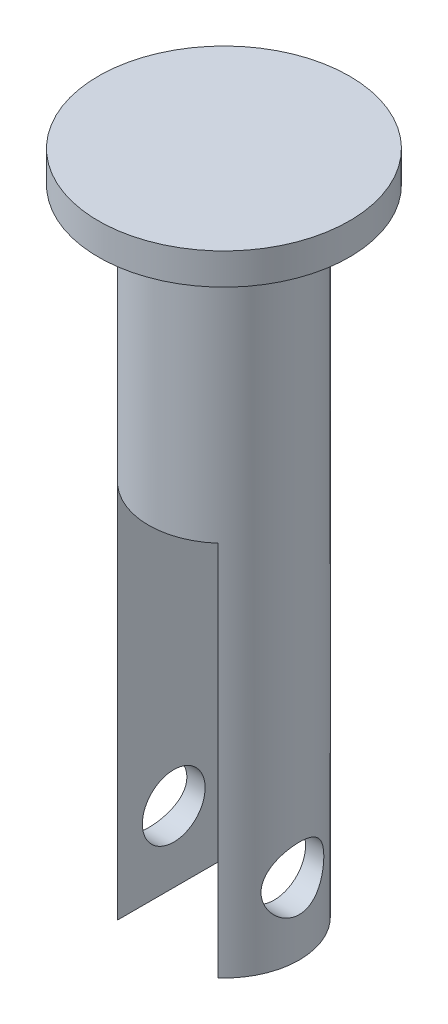
ISO-10303-21;
HEADER;
FILE_DESCRIPTION(('STEP AP214'),'2;1');
FILE_NAME('part.step','',(''),(''),'','','');
FILE_SCHEMA(('AUTOMOTIVE_DESIGN { 1 0 10303 214 1 1 1 1 }'));
ENDSEC;
DATA;
#1=APPLICATION_CONTEXT('core data for automotive mechanical design processes');
#2=APPLICATION_PROTOCOL_DEFINITION('international standard','automotive_design',2000,#1);
#3=PRODUCT_CONTEXT('',#1,'mechanical');
#4=PRODUCT('Part','Part','',(#3));
#5=PRODUCT_RELATED_PRODUCT_CATEGORY('part','',(#4));
#6=PRODUCT_DEFINITION_FORMATION('','',#4);
#7=PRODUCT_DEFINITION_CONTEXT('part definition',#1,'design');
#8=PRODUCT_DEFINITION('design','',#6,#7);
#9=PRODUCT_DEFINITION_SHAPE('','',#8);
#10=(LENGTH_UNIT() NAMED_UNIT(*) SI_UNIT(.MILLI.,.METRE.));
#11=(NAMED_UNIT(*) PLANE_ANGLE_UNIT() SI_UNIT($,.RADIAN.));
#12=(NAMED_UNIT(*) SI_UNIT($,.STERADIAN.) SOLID_ANGLE_UNIT());
#13=UNCERTAINTY_MEASURE_WITH_UNIT(LENGTH_MEASURE(1.E-05),#10,'distance_accuracy_value','');
#14=(GEOMETRIC_REPRESENTATION_CONTEXT(3) GLOBAL_UNCERTAINTY_ASSIGNED_CONTEXT((#13)) GLOBAL_UNIT_ASSIGNED_CONTEXT((#10,
#11,#12)) REPRESENTATION_CONTEXT('',''));
#15=CARTESIAN_POINT('',(0.,0.,0.));
#16=DIRECTION('',(0.,0.,1.));
#17=DIRECTION('',(1.,0.,0.));
#18=AXIS2_PLACEMENT_3D('',#15,#16,#17);
#19=CARTESIAN_POINT('',(11.5440696875448,6.06648320026665,0.));
#20=DIRECTION('',(0.,-1.,0.));
#21=DIRECTION('',(0.,0.,-1.));
#22=AXIS2_PLACEMENT_3D('',#19,#20,#21);
#23=PLANE('',#22);
#24=CARTESIAN_POINT('',(-0.455930312455166,6.06648320026665,0.));
#25=DIRECTION('',(0.,-1.,0.));
#26=DIRECTION('',(0.,0.,-1.));
#27=AXIS2_PLACEMENT_3D('',#24,#25,#26);
#28=CIRCLE('',#27,12.);
#29=CARTESIAN_POINT('',(7.54406968754483,6.06648320026665,-8.94427190999918));
#30=VERTEX_POINT('',#29);
#31=CARTESIAN_POINT('',(7.54406968754483,6.06648320026665,8.94427190999918));
#32=VERTEX_POINT('',#31);
#33=EDGE_CURVE('E93',#30,#32,#28,.T.);
#34=ORIENTED_EDGE('',*,*,#33,.T.);
#35=DIRECTION('',(0.,0.,-1.));
#36=VECTOR('',#35,1.);
#37=CARTESIAN_POINT('',(7.54406968754483,6.06648320026665,0.));
#38=LINE('',#37,#36);
#39=EDGE_CURVE('E112',#32,#30,#38,.T.);
#40=ORIENTED_EDGE('',*,*,#39,.T.);
#41=EDGE_LOOP('',(#34,#40));
#42=FACE_BOUND('',#41,.T.);
#43=ADVANCED_FACE('F35',(#42),#23,.T.);
#44=CARTESIAN_POINT('',(-0.455930312455166,6.06648320026665,0.));
#45=DIRECTION('',(0.,-1.,0.));
#46=DIRECTION('',(0.,0.,-1.));
#47=AXIS2_PLACEMENT_3D('',#44,#45,#46);
#48=CYLINDRICAL_SURFACE('',#47,20.);
#49=CARTESIAN_POINT('',(-0.455930312455166,112.066483200267,0.));
#50=DIRECTION('',(0.,-1.,0.));
#51=DIRECTION('',(0.,0.,-1.));
#52=AXIS2_PLACEMENT_3D('',#49,#50,#51);
#53=CIRCLE('',#52,20.);
#54=CARTESIAN_POINT('',(-0.455930312455166,112.066483200267,-20.));
#55=VERTEX_POINT('',#54);
#56=EDGE_CURVE('E101',#55,#55,#53,.T.);
#57=ORIENTED_EDGE('',*,*,#56,.T.);
#58=EDGE_LOOP('',(#57));
#59=FACE_BOUND('',#58,.T.);
#60=CARTESIAN_POINT('',(-0.455930312455166,107.066483200267,0.));
#61=DIRECTION('',(0.,-1.,0.));
#62=DIRECTION('',(0.,0.,-1.));
#63=AXIS2_PLACEMENT_3D('',#60,#61,#62);
#64=CIRCLE('',#63,20.);
#65=CARTESIAN_POINT('',(-0.455930312455166,107.066483200267,-20.));
#66=VERTEX_POINT('',#65);
#67=EDGE_CURVE('E109',#66,#66,#64,.T.);
#68=ORIENTED_EDGE('',*,*,#67,.F.);
#69=EDGE_LOOP('',(#68));
#70=FACE_BOUND('',#69,.T.);
#71=ADVANCED_FACE('F37',(#59,#70),#48,.T.);
#72=CARTESIAN_POINT('',(19.5440696875448,107.066483200267,0.));
#73=DIRECTION('',(0.,-1.,0.));
#74=DIRECTION('',(0.,0.,-1.));
#75=AXIS2_PLACEMENT_3D('',#72,#73,#74);
#76=PLANE('',#75);
#77=ORIENTED_EDGE('',*,*,#67,.T.);
#78=EDGE_LOOP('',(#77));
#79=FACE_BOUND('',#78,.T.);
#80=CARTESIAN_POINT('',(-0.455930312455166,107.066483200267,0.));
#81=DIRECTION('',(0.,-1.,0.));
#82=DIRECTION('',(0.,0.,-1.));
#83=AXIS2_PLACEMENT_3D('',#80,#81,#82);
#84=CIRCLE('',#83,12.);
#85=CARTESIAN_POINT('',(-0.455930312455166,107.066483200267,-12.));
#86=VERTEX_POINT('',#85);
#87=EDGE_CURVE('E106',#86,#86,#84,.T.);
#88=ORIENTED_EDGE('',*,*,#87,.F.);
#89=EDGE_LOOP('',(#88));
#90=FACE_BOUND('',#89,.T.);
#91=ADVANCED_FACE('F155',(#79,#90),#76,.T.);
#92=CARTESIAN_POINT('',(-0.455930312455166,6.06648320026665,0.));
#93=DIRECTION('',(0.,-1.,0.));
#94=DIRECTION('',(0.,0.,-1.));
#95=AXIS2_PLACEMENT_3D('',#92,#93,#94);
#96=CYLINDRICAL_SURFACE('',#95,12.);
#97=CARTESIAN_POINT('',(-11.3646424270909,17.3470750969617,-5.));
#98=CARTESIAN_POINT('',(-11.3646433889083,17.213673754876,-4.99999907346954));
#99=CARTESIAN_POINT('',(-11.3670979079183,17.0802250063997,-4.99465346647854));
#100=CARTESIAN_POINT('',(-11.3768355291006,16.8142982175734,-4.97332510133915));
#101=CARTESIAN_POINT('',(-11.3841217834814,16.6818208680448,-4.95733539899108));
#102=CARTESIAN_POINT('',(-11.4032949525651,16.4186056235057,-4.91485001389297));
#103=CARTESIAN_POINT('',(-11.4151916415178,16.2878720385531,-4.88833200790255));
#104=CARTESIAN_POINT('',(-11.4431936601102,16.0293167779945,-4.82506361967691));
#105=CARTESIAN_POINT('',(-11.4593007604643,15.9014963521828,-4.7883089319155));
#106=CARTESIAN_POINT('',(-11.495129607935,15.6502214656092,-4.7051161177753));
#107=CARTESIAN_POINT('',(-11.5148346442353,15.5267498449541,-4.65872262741865));
#108=CARTESIAN_POINT('',(-11.5573196855297,15.2842808424347,-4.5565572335341));
#109=CARTESIAN_POINT('',(-11.5801008476228,15.1652851658574,-4.5007817989946));
#110=CARTESIAN_POINT('',(-11.6520781180096,14.8161762680823,-4.32007909456559));
#111=CARTESIAN_POINT('',(-11.7049557990801,14.5936243226733,-4.18166963633182));
#112=CARTESIAN_POINT('',(-11.81816439707,14.1617374200267,-3.86388960131915));
#113=CARTESIAN_POINT('',(-11.8787475171841,13.9538569246124,-3.68264836841193));
#114=CARTESIAN_POINT('',(-11.9985076479036,13.570262139705,-3.28805127368673));
#115=CARTESIAN_POINT('',(-12.0576841087455,13.394560252364,-3.07468308711391));
#116=CARTESIAN_POINT('',(-12.1420475754237,13.1552717190608,-2.72939811902874));
#117=CARTESIAN_POINT('',(-12.1699673241129,13.0782225932807,-2.60726265021164));
#118=CARTESIAN_POINT('',(-12.2230060916566,12.9347607497602,-2.35633907958865));
#119=CARTESIAN_POINT('',(-12.2481262718197,12.8683436166621,-2.22755376893512));
#120=CARTESIAN_POINT('',(-12.2948477532332,12.7467361117422,-1.96416180919324));
#121=CARTESIAN_POINT('',(-12.3164487183859,12.691546812094,-1.82955460564478));
#122=CARTESIAN_POINT('',(-12.3554832392034,12.592981193246,-1.55556138641083));
#123=CARTESIAN_POINT('',(-12.3729188729236,12.5495989820598,-1.41617779348791));
#124=CARTESIAN_POINT('',(-12.4023246899177,12.477025755724,-1.14097065626753));
#125=CARTESIAN_POINT('',(-12.4145305774195,12.447217690051,-1.00533485679253));
#126=CARTESIAN_POINT('',(-12.4343812276892,12.3989672723049,-0.73178367802263));
#127=CARTESIAN_POINT('',(-12.4420280212041,12.380519859761,-0.593869341827157));
#128=CARTESIAN_POINT('',(-12.4525481354847,12.3551844577486,-0.316820356986365));
#129=CARTESIAN_POINT('',(-12.4554221152877,12.3482948723566,-0.17768587948762));
#130=CARTESIAN_POINT('',(-12.4563149877906,12.3461517775978,0.100685666016498));
#131=CARTESIAN_POINT('',(-12.4543340685963,12.3508978174019,0.23992272983814));
#132=CARTESIAN_POINT('',(-12.4458439730803,12.3713231155269,0.508875497772578));
#133=CARTESIAN_POINT('',(-12.4396189964014,12.3863163274377,0.638652954685693));
#134=CARTESIAN_POINT('',(-12.4230982609135,12.4263596128331,0.89642573301948));
#135=CARTESIAN_POINT('',(-12.4128011556935,12.4514130126664,1.02442045048903));
#136=CARTESIAN_POINT('',(-12.3883945544528,12.5113276837473,1.27768058963447));
#137=CARTESIAN_POINT('',(-12.3742863183923,12.54618571374,1.40294689855866));
#138=CARTESIAN_POINT('',(-12.3426043755839,12.6253883276973,1.65000960949552));
#139=CARTESIAN_POINT('',(-12.3250293509214,12.6697365199336,1.77180467168387));
#140=CARTESIAN_POINT('',(-12.267136505965,12.8179433538624,2.13440608091059));
#141=CARTESIAN_POINT('',(-12.2220178885048,12.9360985798832,2.36878813427704));
#142=CARTESIAN_POINT('',(-12.1233551797351,13.206472497409,2.8148876575074));
#143=CARTESIAN_POINT('',(-12.0698081127543,13.3587032273419,3.02659707825227));
#144=CARTESIAN_POINT('',(-11.9552011178358,13.705390255262,3.4373466397403));
#145=CARTESIAN_POINT('',(-11.8938776750895,13.9020665927681,3.63444183536811));
#146=CARTESIAN_POINT('',(-11.7734371483982,14.3259645459124,3.99374958281551));
#147=CARTESIAN_POINT('',(-11.7143209230974,14.5531978937653,4.15594867394866));
#148=CARTESIAN_POINT('',(-11.6314133226803,14.9168435680594,4.37204843185914));
#149=CARTESIAN_POINT('',(-11.6043502623279,15.0441170065627,4.44042007897757));
#150=CARTESIAN_POINT('',(-11.5534679213388,15.3046186242142,4.56609824374461));
#151=CARTESIAN_POINT('',(-11.5296473131995,15.43784433657,4.62340929378706));
#152=CARTESIAN_POINT('',(-11.4860861711708,15.7093077760799,4.72639308965464));
#153=CARTESIAN_POINT('',(-11.4663441480372,15.8475436520869,4.77207008493292));
#154=CARTESIAN_POINT('',(-11.4316627684724,16.1280354548527,4.85130620649788));
#155=CARTESIAN_POINT('',(-11.4167229845655,16.270291022568,4.8848664114044));
#156=CARTESIAN_POINT('',(-11.3930272916656,16.5483174148854,4.93768074905133));
#157=CARTESIAN_POINT('',(-11.3839331028613,16.6839102761429,4.95772169190296));
#158=CARTESIAN_POINT('',(-11.3707826315925,16.9565230093628,4.9866073793505));
#159=CARTESIAN_POINT('',(-11.3667260110495,17.0935427849405,4.99545287528973));
#160=CARTESIAN_POINT('',(-11.363800265462,17.3678611568462,5.00183821697948));
#161=CARTESIAN_POINT('',(-11.36492964285,17.5051596612394,4.9993813265346));
#162=CARTESIAN_POINT('',(-11.3723301244309,17.7789462252484,4.98320111894243));
#163=CARTESIAN_POINT('',(-11.3786010749906,17.9154343089573,4.96947813843228));
#164=CARTESIAN_POINT('',(-11.3954949080972,18.1777908395015,4.93217158492223));
#165=CARTESIAN_POINT('',(-11.4058119355371,18.303777687676,4.90927900797924));
#166=CARTESIAN_POINT('',(-11.430421612036,18.5532705785921,4.85401305684628));
#167=CARTESIAN_POINT('',(-11.4447155391394,18.6767758101203,4.82163663468421));
#168=CARTESIAN_POINT('',(-11.4929497462536,19.0423430891342,4.71071065616067));
#169=CARTESIAN_POINT('',(-11.5322562787283,19.2796555515788,4.61833566351839));
#170=CARTESIAN_POINT('',(-11.6227643240817,19.7455768781879,4.39509042810499));
#171=CARTESIAN_POINT('',(-11.6743990897126,19.97339152819,4.26275559713322));
#172=CARTESIAN_POINT('',(-11.7831281719283,20.4046907670029,3.9648148777464));
#173=CARTESIAN_POINT('',(-11.8402248458239,20.6081647645681,3.79919458936811));
#174=CARTESIAN_POINT('',(-11.9590827423153,21.0023033196877,3.42333828888212));
#175=CARTESIAN_POINT('',(-12.020845300184,21.1905765942588,3.21056780271632));
#176=CARTESIAN_POINT('',(-12.1084700366732,21.4443880596441,2.86918502481984));
#177=CARTESIAN_POINT('',(-12.1368573291907,21.524264902741,2.75160882485037));
#178=CARTESIAN_POINT('',(-12.1912099586883,21.6739275346931,2.50969002115846));
#179=CARTESIAN_POINT('',(-12.2171763377961,21.7437176727456,2.38535036573304));
#180=CARTESIAN_POINT('',(-12.266045914029,21.8728250808241,2.13027929692906));
#181=CARTESIAN_POINT('',(-12.2889394455089,21.9321094840564,1.99952940315085));
#182=CARTESIAN_POINT('',(-12.3309097664715,22.0393637528303,1.73293321082208));
#183=CARTESIAN_POINT('',(-12.3499881973547,22.0873384858158,1.59708913398471));
#184=CARTESIAN_POINT('',(-12.3837742774464,22.171486700663,1.32129951276987));
#185=CARTESIAN_POINT('',(-12.398483099624,22.2076633498343,1.18135508018568));
#186=CARTESIAN_POINT('',(-12.423090852284,22.2678155564273,0.898454675987309));
#187=CARTESIAN_POINT('',(-12.4329901432423,22.2917920282624,0.755498930910138));
#188=CARTESIAN_POINT('',(-12.4471593047944,22.3260102550587,0.477883420739099));
#189=CARTESIAN_POINT('',(-12.451775252411,22.3370972372949,0.343344870081023));
#190=CARTESIAN_POINT('',(-12.4564619150362,22.3483535312239,0.0736837007935092));
#191=CARTESIAN_POINT('',(-12.456531102649,22.3485191741044,-0.0614390988588054));
#192=CARTESIAN_POINT('',(-12.4521190610806,22.3379234580015,-0.331106229534669));
#193=CARTESIAN_POINT('',(-12.4476402900787,22.3271680018905,-0.465650833622079));
#194=CARTESIAN_POINT('',(-12.4342559976125,22.2948525414207,-0.733261310716005));
#195=CARTESIAN_POINT('',(-12.425348827727,22.2732885136691,-0.866326614198361));
#196=CARTESIAN_POINT('',(-12.4037396388927,22.2205447531879,-1.12521434278972));
#197=CARTESIAN_POINT('',(-12.3911854564484,22.189738322778,-1.25112522777306));
#198=CARTESIAN_POINT('',(-12.3624936607287,22.1185841709136,-1.49981842973104));
#199=CARTESIAN_POINT('',(-12.3463547965964,22.0782331185906,-1.62259963790794));
#200=CARTESIAN_POINT('',(-12.2931201498093,21.9433752064597,-1.98503132832704));
#201=CARTESIAN_POINT('',(-12.2511877072998,21.8350199701243,-2.21898154506248));
#202=CARTESIAN_POINT('',(-12.1561600361712,21.5791037146931,-2.67613896894387));
#203=CARTESIAN_POINT('',(-12.1026459668084,21.4299921579181,-2.8983828280104));
#204=CARTESIAN_POINT('',(-11.9907955016307,21.0990601039287,-3.31565850042872));
#205=CARTESIAN_POINT('',(-11.9324573199716,20.9172274640922,-3.51068016389786));
#206=CARTESIAN_POINT('',(-11.8125160439408,20.5112512680126,-3.88182487095485));
#207=CARTESIAN_POINT('',(-11.7509609079349,20.2850705485308,-4.05575892114006));
#208=CARTESIAN_POINT('',(-11.6645516410446,19.9252173610868,-4.28644220599616));
#209=CARTESIAN_POINT('',(-11.6367143698067,19.8017206565871,-4.3583492231784));
#210=CARTESIAN_POINT('',(-11.5838796152136,19.5485635724725,-4.49153302890032));
#211=CARTESIAN_POINT('',(-11.558880839876,19.4189060354784,-4.5528146604858));
#212=CARTESIAN_POINT('',(-11.5126646028848,19.1548873906866,-4.66392927630358));
#213=CARTESIAN_POINT('',(-11.4914294059696,19.0205521179995,-4.71381629567019));
#214=CARTESIAN_POINT('',(-11.453347042288,18.7475824099957,-4.80199267289388));
#215=CARTESIAN_POINT('',(-11.4364977251061,18.6089501189805,-4.84028771585243));
#216=CARTESIAN_POINT('',(-11.4078425877029,18.3287832330414,-4.90477948429217));
#217=CARTESIAN_POINT('',(-11.3960234575957,18.1872573490015,-4.93100815251904));
#218=CARTESIAN_POINT('',(-11.3778334017707,17.9021990433414,-4.9711694184283));
#219=CARTESIAN_POINT('',(-11.3714582387506,17.7586682708302,-4.98511157956285));
#220=CARTESIAN_POINT('',(-11.3668331612397,17.5702232530872,-4.99521783051923));
#221=CARTESIAN_POINT('',(-11.3660121740215,17.5256183386468,-4.99701063605637));
#222=CARTESIAN_POINT('',(-11.3649166434734,17.4363690856008,-4.99940188134453));
#223=CARTESIAN_POINT('',(-11.364642105169,17.3917247466363,-5.00000031011128));
#224=CARTESIAN_POINT('',(-11.3646424270909,17.3470750969617,-5.));
#225=B_SPLINE_CURVE_WITH_KNOTS('',3,(#97,#98,#99,#100,#101,#102,#103,#104,#105,#106,#107,#108,
#109,#110,#111,#112,#113,#114,#115,#116,#117,#118,#119,#120,#121,#122,#123,#124,#125,#126,#127,
#128,#129,#130,#131,#132,#133,#134,#135,#136,#137,#138,#139,#140,#141,#142,#143,#144,#145,#146,
#147,#148,#149,#150,#151,#152,#153,#154,#155,#156,#157,#158,#159,#160,#161,#162,#163,#164,#165,
#166,#167,#168,#169,#170,#171,#172,#173,#174,#175,#176,#177,#178,#179,#180,#181,#182,#183,#184,
#185,#186,#187,#188,#189,#190,#191,#192,#193,#194,#195,#196,#197,#198,#199,#200,#201,#202,#203,
#204,#205,#206,#207,#208,#209,#210,#211,#212,#213,#214,#215,#216,#217,#218,#219,#220,#221,#222,
#223,#224),.UNSPECIFIED.,.T.,.F.,(4,2,2,2,2,2,2,2,2,2,2,2,2,2,2,2,2,2,2,2,2,2,2,2,2,2,2,2,2,2,2,
2,2,2,2,2,2,2,2,2,2,2,2,2,2,2,2,2,2,2,2,2,2,2,2,2,2,2,2,2,2,2,2,4),(0.,0.40015743600017,
0.80057619059322,1.201848529411,1.60328989804516,2.00291210380929,2.40268505027808,
3.20123019587003,4.04483609889578,4.88876646006605,5.32954710296567,5.77014421661472,
6.2107833842476,6.6512022587805,7.0688822540997,7.48637606389429,7.90381222072139,
8.32123220399826,8.71313663078892,9.10517074557807,9.49707541213125,9.88912935105432,
10.6843842085816,11.4799204638783,12.3315328967583,13.1834732406336,13.6239634696043,
14.064272810136,14.5044210919574,14.9445301827247,15.3560893757574,15.7676209469674,
16.1790336871391,16.5904341345125,16.9753736617613,17.3604370390525,18.129966872946,
18.9320860691316,19.7345530282234,20.6023475058253,21.0367677320598,21.4710000820441,
21.9065678086378,22.3419477324182,22.7772106778488,23.2124409951531,23.6171514188591,
24.0219977964934,24.4266254703975,24.8314038752673,25.2216396203095,25.6120117507034,
26.3921129345308,27.2074696624053,28.0231295912,28.8942922255873,29.3306260081945,
29.7667603842385,30.2007814897644,30.6345893903394,31.0672421881929,31.4995579237516,
31.6334900472163,31.7674234024044),.UNSPECIFIED.);
#226=CARTESIAN_POINT('',(-11.3646424270909,17.3470750969617,-5.));
#227=VERTEX_POINT('',#226);
#228=EDGE_CURVE('E87',#227,#227,#225,.T.);
#229=ORIENTED_EDGE('',*,*,#228,.F.);
#230=EDGE_LOOP('',(#229));
#231=FACE_BOUND('',#230,.T.);
#232=CARTESIAN_POINT('',(10.4527818021806,17.3470750969617,-5.));
#233=CARTESIAN_POINT('',(10.452782763998,17.4804764390473,-4.99999907346954));
#234=CARTESIAN_POINT('',(10.455237283008,17.6139251875236,-4.99465346647854));
#235=CARTESIAN_POINT('',(10.4649749041902,17.8798519763499,-4.97332510133915));
#236=CARTESIAN_POINT('',(10.4722611585711,18.0123293258785,-4.95733539899108));
#237=CARTESIAN_POINT('',(10.4914343276548,18.2755445704177,-4.91485001389297));
#238=CARTESIAN_POINT('',(10.5033310166075,18.4062781553702,-4.88833200790255));
#239=CARTESIAN_POINT('',(10.5313330351999,18.6648334159288,-4.82506361967691));
#240=CARTESIAN_POINT('',(10.547440135554,18.7926538417406,-4.7883089319155));
#241=CARTESIAN_POINT('',(10.5832689830247,19.0439287283141,-4.7051161177753));
#242=CARTESIAN_POINT('',(10.602974019325,19.1674003489692,-4.65872262741865));
#243=CARTESIAN_POINT('',(10.6454590606193,19.4098693514886,-4.5565572335341));
#244=CARTESIAN_POINT('',(10.6682402227125,19.5288650280659,-4.5007817989946));
#245=CARTESIAN_POINT('',(10.7402174930992,19.877973925841,-4.32007909456559));
#246=CARTESIAN_POINT('',(10.7930951741698,20.1005258712501,-4.18166963633182));
#247=CARTESIAN_POINT('',(10.9063037721597,20.5324127738966,-3.86388960131915));
#248=CARTESIAN_POINT('',(10.9668868922737,20.740293269311,-3.68264836841193));
#249=CARTESIAN_POINT('',(11.0866470229933,21.1238880542184,-3.28805127368673));
#250=CARTESIAN_POINT('',(11.1458234838352,21.2995899415593,-3.07468308711391));
#251=CARTESIAN_POINT('',(11.2301869505134,21.5388784748625,-2.72939811902874));
#252=CARTESIAN_POINT('',(11.2581066992025,21.6159276006426,-2.60726265021164));
#253=CARTESIAN_POINT('',(11.3111454667463,21.7593894441631,-2.35633907958865));
#254=CARTESIAN_POINT('',(11.3362656469094,21.8258065772612,-2.22755376893512));
#255=CARTESIAN_POINT('',(11.3829871283229,21.9474140821812,-1.96416180919325));
#256=CARTESIAN_POINT('',(11.4045880934755,22.0026033818293,-1.82955460564478));
#257=CARTESIAN_POINT('',(11.4436226142931,22.1011690006774,-1.55556138641083));
#258=CARTESIAN_POINT('',(11.4610582480133,22.1445512118635,-1.41617779348791));
#259=CARTESIAN_POINT('',(11.4904640650073,22.2171244381994,-1.14097065626753));
#260=CARTESIAN_POINT('',(11.5026699525091,22.2469325038724,-1.00533485679253));
#261=CARTESIAN_POINT('',(11.5225206027789,22.2951829216184,-0.731783678022631));
#262=CARTESIAN_POINT('',(11.5301673962938,22.3136303341623,-0.593869341827157));
#263=CARTESIAN_POINT('',(11.5406875105744,22.3389657361748,-0.316820356986365));
#264=CARTESIAN_POINT('',(11.5435614903774,22.3458553215667,-0.17768587948762));
#265=CARTESIAN_POINT('',(11.5444543628803,22.3479984163256,0.100685666016499));
#266=CARTESIAN_POINT('',(11.542473443686,22.3432523765215,0.239922729838141));
#267=CARTESIAN_POINT('',(11.5339833481699,22.3228270783965,0.508875497772579));
#268=CARTESIAN_POINT('',(11.527758371491,22.3078338664856,0.638652954685695));
#269=CARTESIAN_POINT('',(11.5112376360031,22.2677905810902,0.896425733019482));
#270=CARTESIAN_POINT('',(11.5009405307831,22.2427371812569,1.02442045048904));
#271=CARTESIAN_POINT('',(11.4765339295425,22.182822510176,1.27768058963447));
#272=CARTESIAN_POINT('',(11.462425693482,22.1479644801833,1.40294689855866));
#273=CARTESIAN_POINT('',(11.4307437506736,22.068761866226,1.65000960949552));
#274=CARTESIAN_POINT('',(11.4131687260111,22.0244136739897,1.77180467168387));
#275=CARTESIAN_POINT('',(11.3552758810547,21.8762068400609,2.13440608091059));
#276=CARTESIAN_POINT('',(11.3101572635945,21.7580516140401,2.36878813427704));
#277=CARTESIAN_POINT('',(11.2114945548248,21.4876776965143,2.8148876575074));
#278=CARTESIAN_POINT('',(11.157947487844,21.3354469665814,3.02659707825228));
#279=CARTESIAN_POINT('',(11.0433404929254,20.9887599386614,3.4373466397403));
#280=CARTESIAN_POINT('',(10.9820170501791,20.7920836011553,3.63444183536811));
#281=CARTESIAN_POINT('',(10.8615765234878,20.368185648011,3.99374958281551));
#282=CARTESIAN_POINT('',(10.8024602981871,20.140952300158,4.15594867394866));
#283=CARTESIAN_POINT('',(10.71955269777,19.7773066258639,4.37204843185914));
#284=CARTESIAN_POINT('',(10.6924896374176,19.6500331873606,4.44042007897757));
#285=CARTESIAN_POINT('',(10.6416072964285,19.3895315697091,4.56609824374461));
#286=CARTESIAN_POINT('',(10.6177866882892,19.2563058573533,4.62340929378706));
#287=CARTESIAN_POINT('',(10.5742255462605,18.9848424178434,4.72639308965464));
#288=CARTESIAN_POINT('',(10.5544835231269,18.8466065418365,4.77207008493292));
#289=CARTESIAN_POINT('',(10.519802143562,18.5661147390706,4.85130620649788));
#290=CARTESIAN_POINT('',(10.5048623596552,18.4238591713553,4.8848664114044));
#291=CARTESIAN_POINT('',(10.4811666667553,18.145832779038,4.93768074905133));
#292=CARTESIAN_POINT('',(10.472072477951,18.0102399177804,4.95772169190296));
#293=CARTESIAN_POINT('',(10.4589220066822,17.7376271845605,4.9866073793505));
#294=CARTESIAN_POINT('',(10.4548653861392,17.6006074089828,4.99545287528973));
#295=CARTESIAN_POINT('',(10.4519396405517,17.3262890370771,5.00183821697948));
#296=CARTESIAN_POINT('',(10.4530690179397,17.188990532684,4.9993813265346));
#297=CARTESIAN_POINT('',(10.4604694995205,16.9152039686749,4.98320111894243));
#298=CARTESIAN_POINT('',(10.4667404500802,16.778715884966,4.96947813843228));
#299=CARTESIAN_POINT('',(10.4836342831869,16.5163593544218,4.93217158492223));
#300=CARTESIAN_POINT('',(10.4939513106268,16.3903725062473,4.90927900797924));
#301=CARTESIAN_POINT('',(10.5185609871257,16.1408796153312,4.85401305684628));
#302=CARTESIAN_POINT('',(10.5328549142291,16.017374383803,4.82163663468421));
#303=CARTESIAN_POINT('',(10.5810891213433,15.6518071047891,4.71071065616066));
#304=CARTESIAN_POINT('',(10.620395653818,15.4144946423445,4.61833566351839));
#305=CARTESIAN_POINT('',(10.7109036991714,14.9485733157355,4.39509042810499));
#306=CARTESIAN_POINT('',(10.7625384648022,14.7207586657334,4.26275559713322));
#307=CARTESIAN_POINT('',(10.871267547018,14.2894594269205,3.96481487774639));
#308=CARTESIAN_POINT('',(10.9283642209136,14.0859854293552,3.79919458936811));
#309=CARTESIAN_POINT('',(11.047222117405,13.6918468742356,3.42333828888212));
#310=CARTESIAN_POINT('',(11.1089846752737,13.5035735996645,3.21056780271631));
#311=CARTESIAN_POINT('',(11.1966094117628,13.2497621342792,2.86918502481984));
#312=CARTESIAN_POINT('',(11.2249967042804,13.1698852911823,2.75160882485037));
#313=CARTESIAN_POINT('',(11.279349333778,13.0202226592302,2.50969002115846));
#314=CARTESIAN_POINT('',(11.3053157128858,12.9504325211777,2.38535036573304));
#315=CARTESIAN_POINT('',(11.3541852891187,12.8213251130992,2.13027929692906));
#316=CARTESIAN_POINT('',(11.3770788205986,12.762040709867,1.99952940315085));
#317=CARTESIAN_POINT('',(11.4190491415612,12.6547864410931,1.73293321082208));
#318=CARTESIAN_POINT('',(11.4381275724444,12.6068117081075,1.59708913398471));
#319=CARTESIAN_POINT('',(11.471913652536,12.5226634932603,1.32129951276987));
#320=CARTESIAN_POINT('',(11.4866224747136,12.486486844089,1.18135508018567));
#321=CARTESIAN_POINT('',(11.5112302273737,12.4263346374961,0.898454675987305));
#322=CARTESIAN_POINT('',(11.5211295183319,12.402358165661,0.755498930910135));
#323=CARTESIAN_POINT('',(11.5352986798841,12.3681399388647,0.477883420739098));
#324=CARTESIAN_POINT('',(11.5399146275007,12.3570529566284,0.343344870081023));
#325=CARTESIAN_POINT('',(11.5446012901259,12.3457966626995,0.0736837007935101));
#326=CARTESIAN_POINT('',(11.5446704777387,12.3456310198189,-0.0614390988588045));
#327=CARTESIAN_POINT('',(11.5402584361703,12.3562267359218,-0.33110622953467));
#328=CARTESIAN_POINT('',(11.5357796651683,12.3669821920328,-0.46565083362208));
#329=CARTESIAN_POINT('',(11.5223953727022,12.3992976525026,-0.733261310716008));
#330=CARTESIAN_POINT('',(11.5134882028167,12.4208616802542,-0.866326614198363));
#331=CARTESIAN_POINT('',(11.4918790139823,12.4736054407354,-1.12521434278972));
#332=CARTESIAN_POINT('',(11.4793248315381,12.5044118711453,-1.25112522777306));
#333=CARTESIAN_POINT('',(11.4506330358184,12.5755660230098,-1.49981842973105));
#334=CARTESIAN_POINT('',(11.434494171686,12.6159170753327,-1.62259963790794));
#335=CARTESIAN_POINT('',(11.381259524899,12.7507749874636,-1.98503132832704));
#336=CARTESIAN_POINT('',(11.3393270823894,12.8591302237991,-2.21898154506248));
#337=CARTESIAN_POINT('',(11.2442994112609,13.1150464792303,-2.67613896894387));
#338=CARTESIAN_POINT('',(11.1907853418981,13.2641580360053,-2.8983828280104));
#339=CARTESIAN_POINT('',(11.0789348767204,13.5950900899947,-3.31565850042873));
#340=CARTESIAN_POINT('',(11.0205966950612,13.7769227298312,-3.51068016389786));
#341=CARTESIAN_POINT('',(10.9006554190305,14.1828989259107,-3.88182487095485));
#342=CARTESIAN_POINT('',(10.8391002830246,14.4090796453926,-4.05575892114007));
#343=CARTESIAN_POINT('',(10.7526910161343,14.7689328328366,-4.28644220599617));
#344=CARTESIAN_POINT('',(10.7248537448964,14.8924295373363,-4.35834922317841));
#345=CARTESIAN_POINT('',(10.6720189903033,15.1455866214509,-4.49153302890032));
#346=CARTESIAN_POINT('',(10.6470202149657,15.275244158445,-4.5528146604858));
#347=CARTESIAN_POINT('',(10.6008039779744,15.5392628032367,-4.66392927630358));
#348=CARTESIAN_POINT('',(10.5795687810592,15.6735980759238,-4.7138162956702));
#349=CARTESIAN_POINT('',(10.5414864173777,15.9465677839276,-4.80199267289388));
#350=CARTESIAN_POINT('',(10.5246371001958,16.0852000749429,-4.84028771585243));
#351=CARTESIAN_POINT('',(10.4959819627925,16.3653669608819,-4.90477948429217));
#352=CARTESIAN_POINT('',(10.4841628326853,16.5068928449218,-4.93100815251904));
#353=CARTESIAN_POINT('',(10.4659727768603,16.791951150582,-4.9711694184283));
#354=CARTESIAN_POINT('',(10.4595976138403,16.9354819230932,-4.98511157956285));
#355=CARTESIAN_POINT('',(10.4549725363294,17.1239269408362,-4.99521783051923));
#356=CARTESIAN_POINT('',(10.4541515491111,17.1685318552765,-4.99701063605637));
#357=CARTESIAN_POINT('',(10.453056018563,17.2577811083225,-4.99940188134453));
#358=CARTESIAN_POINT('',(10.4527814802587,17.302425447287,-5.00000031011128));
#359=CARTESIAN_POINT('',(10.4527818021806,17.3470750969617,-5.));
#360=B_SPLINE_CURVE_WITH_KNOTS('',3,(#232,#233,#234,#235,#236,#237,#238,#239,#240,#241,#242,
#243,#244,#245,#246,#247,#248,#249,#250,#251,#252,#253,#254,#255,#256,#257,#258,#259,#260,#261,
#262,#263,#264,#265,#266,#267,#268,#269,#270,#271,#272,#273,#274,#275,#276,#277,#278,#279,#280,
#281,#282,#283,#284,#285,#286,#287,#288,#289,#290,#291,#292,#293,#294,#295,#296,#297,#298,#299,
#300,#301,#302,#303,#304,#305,#306,#307,#308,#309,#310,#311,#312,#313,#314,#315,#316,#317,#318,
#319,#320,#321,#322,#323,#324,#325,#326,#327,#328,#329,#330,#331,#332,#333,#334,#335,#336,#337,
#338,#339,#340,#341,#342,#343,#344,#345,#346,#347,#348,#349,#350,#351,#352,#353,#354,#355,#356,
#357,#358,#359),.UNSPECIFIED.,.T.,.F.,(4,2,2,2,2,2,2,2,2,2,2,2,2,2,2,2,2,2,2,2,2,2,2,2,2,2,2,2,
2,2,2,2,2,2,2,2,2,2,2,2,2,2,2,2,2,2,2,2,2,2,2,2,2,2,2,2,2,2,2,2,2,2,2,4),(0.,0.40015743600017,
0.80057619059322,1.201848529411,1.60328989804516,2.00291210380928,2.40268505027807,
3.20123019587003,4.04483609889578,4.88876646006605,5.32954710296567,5.77014421661471,
6.2107833842476,6.6512022587805,7.0688822540997,7.48637606389429,7.90381222072139,
8.32123220399826,8.71313663078892,9.10517074557807,9.49707541213126,9.88912935105432,
10.6843842085816,11.4799204638783,12.3315328967583,13.1834732406336,13.6239634696043,
14.064272810136,14.5044210919574,14.9445301827247,15.3560893757574,15.7676209469674,
16.1790336871391,16.5904341345125,16.9753736617613,17.3604370390525,18.129966872946,
18.9320860691316,19.7345530282234,20.6023475058253,21.0367677320598,21.4710000820441,
21.9065678086378,22.3419477324182,22.7772106778488,23.2124409951531,23.6171514188591,
24.0219977964934,24.4266254703975,24.8314038752673,25.2216396203095,25.6120117507034,
26.3921129345308,27.2074696624053,28.0231295912,28.8942922255873,29.3306260081945,
29.7667603842385,30.2007814897643,30.6345893903394,31.0672421881929,31.4995579237516,
31.6334900472163,31.7674234024044),.UNSPECIFIED.);
#361=CARTESIAN_POINT('',(10.4527818021806,17.3470750969617,-5.));
#362=VERTEX_POINT('',#361);
#363=EDGE_CURVE('E125',#362,#362,#360,.T.);
#364=ORIENTED_EDGE('',*,*,#363,.F.);
#365=EDGE_LOOP('',(#364));
#366=FACE_BOUND('',#365,.T.);
#367=DIRECTION('',(0.,-1.,0.));
#368=VECTOR('',#367,1.);
#369=CARTESIAN_POINT('',(-8.45593031245517,6.06648320026665,-8.94427190999916));
#370=LINE('',#369,#368);
#371=CARTESIAN_POINT('',(-8.45593031245517,6.06648320026665,-8.94427190999917));
#372=VERTEX_POINT('',#371);
#373=CARTESIAN_POINT('',(-8.45593031245518,66.0664832002667,-8.94427190999916));
#374=VERTEX_POINT('',#373);
#375=EDGE_CURVE('E96',#372,#374,#370,.F.);
#376=ORIENTED_EDGE('',*,*,#375,.F.);
#377=CARTESIAN_POINT('',(-8.45593031245517,6.06648320026665,8.94427190999917));
#378=VERTEX_POINT('',#377);
#379=EDGE_CURVE('E104',#378,#372,#28,.T.);
#380=ORIENTED_EDGE('',*,*,#379,.F.);
#381=DIRECTION('',(0.,-1.,0.));
#382=VECTOR('',#381,1.);
#383=CARTESIAN_POINT('',(-8.45593031245517,6.06648320026665,8.94427190999916));
#384=LINE('',#383,#382);
#385=CARTESIAN_POINT('',(-8.45593031245518,66.0664832002667,8.94427190999916));
#386=VERTEX_POINT('',#385);
#387=EDGE_CURVE('E94',#386,#378,#384,.T.);
#388=ORIENTED_EDGE('',*,*,#387,.F.);
#389=CARTESIAN_POINT('',(-0.455930312455166,66.0664832002667,0.));
#390=DIRECTION('',(0.,-1.,0.));
#391=DIRECTION('',(0.,0.,-1.));
#392=AXIS2_PLACEMENT_3D('',#389,#390,#391);
#393=CIRCLE('',#392,12.);
#394=CARTESIAN_POINT('',(7.54406968754482,66.0664832002667,8.94427190999917));
#395=VERTEX_POINT('',#394);
#396=EDGE_CURVE('E44',#386,#395,#393,.F.);
#397=ORIENTED_EDGE('',*,*,#396,.T.);
#398=DIRECTION('',(0.,-1.,0.));
#399=VECTOR('',#398,1.);
#400=CARTESIAN_POINT('',(7.54406968754483,6.06648320026665,8.94427190999917));
#401=LINE('',#400,#399);
#402=EDGE_CURVE('E86',#395,#32,#401,.T.);
#403=ORIENTED_EDGE('',*,*,#402,.T.);
#404=ORIENTED_EDGE('',*,*,#33,.F.);
#405=DIRECTION('',(0.,-1.,0.));
#406=VECTOR('',#405,1.);
#407=CARTESIAN_POINT('',(7.54406968754483,6.06648320026665,-8.94427190999917));
#408=LINE('',#407,#406);
#409=CARTESIAN_POINT('',(7.54406968754482,66.0664832002667,-8.94427190999917));
#410=VERTEX_POINT('',#409);
#411=EDGE_CURVE('E51',#30,#410,#408,.F.);
#412=ORIENTED_EDGE('',*,*,#411,.T.);
#413=EDGE_CURVE('E11',#410,#374,#393,.F.);
#414=ORIENTED_EDGE('',*,*,#413,.T.);
#415=EDGE_LOOP('',(#376,#380,#388,#397,#403,#404,#412,#414));
#416=FACE_BOUND('',#415,.T.);
#417=ORIENTED_EDGE('',*,*,#87,.T.);
#418=EDGE_LOOP('',(#417));
#419=FACE_BOUND('',#418,.T.);
#420=ADVANCED_FACE('F90',(#231,#366,#416,#419),#96,.T.);
#421=DIRECTION('',(0.,0.,-1.));
#422=VECTOR('',#421,1.);
#423=CARTESIAN_POINT('',(-8.45593031245517,6.06648320026665,0.));
#424=LINE('',#423,#422);
#425=EDGE_CURVE('E59',#378,#372,#424,.T.);
#426=ORIENTED_EDGE('',*,*,#425,.F.);
#427=ORIENTED_EDGE('',*,*,#379,.T.);
#428=EDGE_LOOP('',(#426,#427));
#429=FACE_BOUND('',#428,.T.);
#430=ADVANCED_FACE('F148',(#429),#23,.T.);
#431=CARTESIAN_POINT('',(-0.455930312455166,112.066483200267,0.));
#432=DIRECTION('',(0.,1.,0.));
#433=DIRECTION('',(0.,0.,1.));
#434=AXIS2_PLACEMENT_3D('',#431,#432,#433);
#435=PLANE('',#434);
#436=ORIENTED_EDGE('',*,*,#56,.F.);
#437=EDGE_LOOP('',(#436));
#438=FACE_BOUND('',#437,.T.);
#439=ADVANCED_FACE('F145',(#438),#435,.T.);
#440=CARTESIAN_POINT('',(-8.45593031245518,66.0664832002667,-15.));
#441=DIRECTION('',(-1.,0.,0.));
#442=DIRECTION('',(0.,-1.,0.));
#443=AXIS2_PLACEMENT_3D('',#440,#441,#442);
#444=PLANE('',#443);
#445=CARTESIAN_POINT('',(-8.45593031245517,17.3470750969617,0.));
#446=DIRECTION('',(-1.,0.,0.));
#447=DIRECTION('',(0.,-1.,0.));
#448=AXIS2_PLACEMENT_3D('',#445,#446,#447);
#449=CIRCLE('',#448,5.);
#450=CARTESIAN_POINT('',(-8.45593031245517,12.3470750969617,0.));
#451=VERTEX_POINT('',#450);
#452=EDGE_CURVE('E218',#451,#451,#449,.T.);
#453=ORIENTED_EDGE('',*,*,#452,.T.);
#454=EDGE_LOOP('',(#453));
#455=FACE_BOUND('',#454,.T.);
#456=ORIENTED_EDGE('',*,*,#375,.T.);
#457=DIRECTION('',(0.,0.,1.));
#458=VECTOR('',#457,1.);
#459=CARTESIAN_POINT('',(-8.45593031245518,66.0664832002667,-15.));
#460=LINE('',#459,#458);
#461=EDGE_CURVE('E82',#374,#386,#460,.T.);
#462=ORIENTED_EDGE('',*,*,#461,.T.);
#463=ORIENTED_EDGE('',*,*,#387,.T.);
#464=ORIENTED_EDGE('',*,*,#425,.T.);
#465=EDGE_LOOP('',(#456,#462,#463,#464));
#466=FACE_BOUND('',#465,.T.);
#467=ADVANCED_FACE('F116',(#455,#466),#444,.F.);
#468=CARTESIAN_POINT('',(-8.45593031245518,66.0664832002667,-15.));
#469=DIRECTION('',(0.,-1.,0.));
#470=DIRECTION('',(0.,0.,-1.));
#471=AXIS2_PLACEMENT_3D('',#468,#469,#470);
#472=PLANE('',#471);
#473=ORIENTED_EDGE('',*,*,#461,.F.);
#474=ORIENTED_EDGE('',*,*,#413,.F.);
#475=DIRECTION('',(0.,0.,1.));
#476=VECTOR('',#475,1.);
#477=CARTESIAN_POINT('',(7.54406968754482,66.0664832002667,-15.));
#478=LINE('',#477,#476);
#479=EDGE_CURVE('E79',#410,#395,#478,.T.);
#480=ORIENTED_EDGE('',*,*,#479,.T.);
#481=ORIENTED_EDGE('',*,*,#396,.F.);
#482=EDGE_LOOP('',(#473,#474,#480,#481));
#483=FACE_BOUND('',#482,.T.);
#484=ADVANCED_FACE('F78',(#483),#472,.T.);
#485=CARTESIAN_POINT('',(7.54406968754482,66.0664832002667,-15.));
#486=DIRECTION('',(-1.,0.,0.));
#487=DIRECTION('',(0.,-1.,0.));
#488=AXIS2_PLACEMENT_3D('',#485,#486,#487);
#489=PLANE('',#488);
#490=CARTESIAN_POINT('',(7.54406968754483,17.3470750969617,0.));
#491=DIRECTION('',(-1.,0.,0.));
#492=DIRECTION('',(0.,-1.,0.));
#493=AXIS2_PLACEMENT_3D('',#490,#491,#492);
#494=CIRCLE('',#493,5.);
#495=CARTESIAN_POINT('',(7.54406968754483,12.3470750969617,0.));
#496=VERTEX_POINT('',#495);
#497=EDGE_CURVE('E39',#496,#496,#494,.T.);
#498=ORIENTED_EDGE('',*,*,#497,.F.);
#499=EDGE_LOOP('',(#498));
#500=FACE_BOUND('',#499,.T.);
#501=ORIENTED_EDGE('',*,*,#39,.F.);
#502=ORIENTED_EDGE('',*,*,#402,.F.);
#503=ORIENTED_EDGE('',*,*,#479,.F.);
#504=ORIENTED_EDGE('',*,*,#411,.F.);
#505=EDGE_LOOP('',(#501,#502,#503,#504));
#506=FACE_BOUND('',#505,.T.);
#507=ADVANCED_FACE('F84',(#500,#506),#489,.T.);
#508=CARTESIAN_POINT('',(-15.,17.3470750969617,0.));
#509=DIRECTION('',(1.,0.,0.));
#510=DIRECTION('',(0.,0.,-1.));
#511=AXIS2_PLACEMENT_3D('',#508,#509,#510);
#512=CYLINDRICAL_SURFACE('',#511,5.);
#513=ORIENTED_EDGE('',*,*,#363,.T.);
#514=EDGE_LOOP('',(#513));
#515=FACE_BOUND('',#514,.T.);
#516=ORIENTED_EDGE('',*,*,#497,.T.);
#517=EDGE_LOOP('',(#516));
#518=FACE_BOUND('',#517,.T.);
#519=ADVANCED_FACE('F131',(#515,#518),#512,.F.);
#520=ORIENTED_EDGE('',*,*,#228,.T.);
#521=EDGE_LOOP('',(#520));
#522=FACE_BOUND('',#521,.T.);
#523=ORIENTED_EDGE('',*,*,#452,.F.);
#524=EDGE_LOOP('',(#523));
#525=FACE_BOUND('',#524,.T.);
#526=ADVANCED_FACE('F135',(#522,#525),#512,.F.);
#527=CLOSED_SHELL('',(#43,#71,#91,#420,#430,#439,#467,#484,#507,#519,#526));
#528=MANIFOLD_SOLID_BREP('B2',#527);
#529=ADVANCED_BREP_SHAPE_REPRESENTATION('',(#18,#528),#14);
#530=SHAPE_DEFINITION_REPRESENTATION(#9,#529);
ENDSEC;
END-ISO-10303-21;
